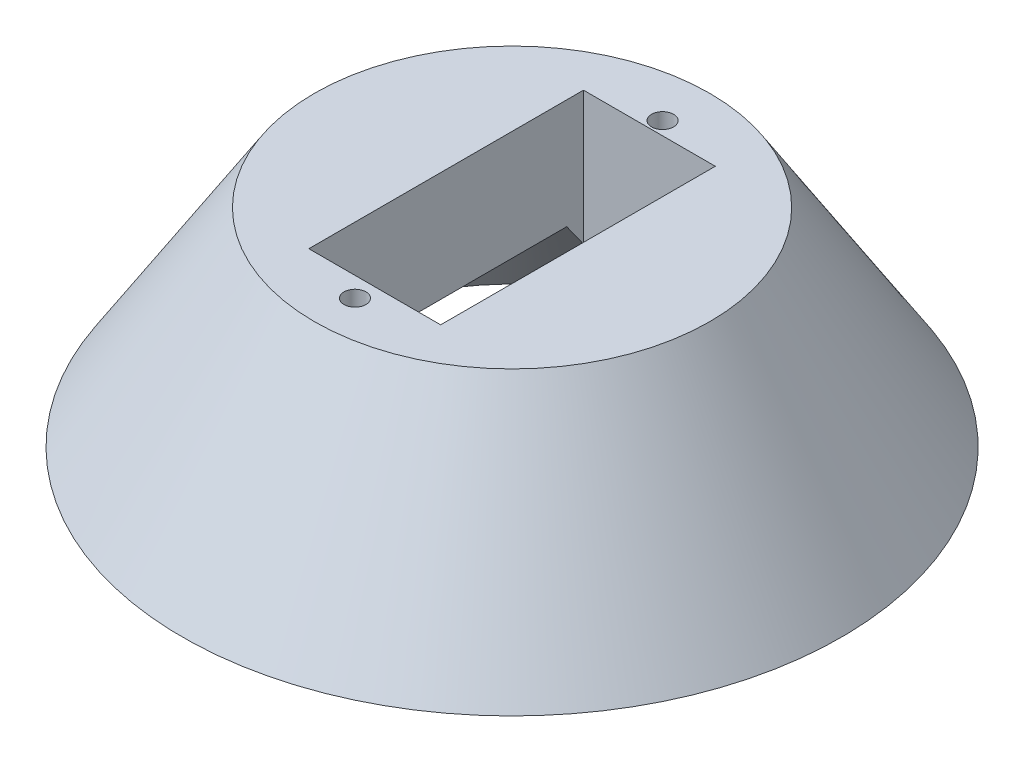
ISO-10303-21;
HEADER;
FILE_DESCRIPTION(('STEP AP214'),'2;1');
FILE_NAME('part.step','',(''),(''),'','','');
FILE_SCHEMA(('AUTOMOTIVE_DESIGN { 1 0 10303 214 1 1 1 1 }'));
ENDSEC;
DATA;
#1=APPLICATION_CONTEXT('core data for automotive mechanical design processes');
#2=APPLICATION_PROTOCOL_DEFINITION('international standard','automotive_design',2000,#1);
#3=PRODUCT_CONTEXT('',#1,'mechanical');
#4=PRODUCT('Part','Part','',(#3));
#5=PRODUCT_RELATED_PRODUCT_CATEGORY('part','',(#4));
#6=PRODUCT_DEFINITION_FORMATION('','',#4);
#7=PRODUCT_DEFINITION_CONTEXT('part definition',#1,'design');
#8=PRODUCT_DEFINITION('design','',#6,#7);
#9=PRODUCT_DEFINITION_SHAPE('','',#8);
#10=(LENGTH_UNIT() NAMED_UNIT(*) SI_UNIT(.MILLI.,.METRE.));
#11=(NAMED_UNIT(*) PLANE_ANGLE_UNIT() SI_UNIT($,.RADIAN.));
#12=(NAMED_UNIT(*) SI_UNIT($,.STERADIAN.) SOLID_ANGLE_UNIT());
#13=UNCERTAINTY_MEASURE_WITH_UNIT(LENGTH_MEASURE(1.E-05),#10,'distance_accuracy_value','');
#14=(GEOMETRIC_REPRESENTATION_CONTEXT(3) GLOBAL_UNCERTAINTY_ASSIGNED_CONTEXT((#13)) GLOBAL_UNIT_ASSIGNED_CONTEXT((#10,
#11,#12)) REPRESENTATION_CONTEXT('',''));
#15=CARTESIAN_POINT('',(0.,0.,0.));
#16=DIRECTION('',(0.,0.,1.));
#17=DIRECTION('',(1.,0.,0.));
#18=AXIS2_PLACEMENT_3D('',#15,#16,#17);
#19=CARTESIAN_POINT('',(0.,8.87265515455283,0.));
#20=DIRECTION('',(0.,-1.,0.));
#21=DIRECTION('',(0.,0.,-1.));
#22=AXIS2_PLACEMENT_3D('',#19,#20,#21);
#23=PLANE('',#22);
#24=DIRECTION('',(0.,0.,1.));
#25=VECTOR('',#24,1.);
#26=CARTESIAN_POINT('',(6.,8.87265515455283,0.));
#27=LINE('',#26,#25);
#28=CARTESIAN_POINT('',(6.,8.87265515455283,-10.9751087622099));
#29=VERTEX_POINT('',#28);
#30=CARTESIAN_POINT('',(6.,8.87265515455283,10.9751087622099));
#31=VERTEX_POINT('',#30);
#32=EDGE_CURVE('E143',#29,#31,#27,.T.);
#33=ORIENTED_EDGE('',*,*,#32,.F.);
#34=CARTESIAN_POINT('',(0.,8.87265515455283,0.));
#35=DIRECTION('',(0.,-1.,0.));
#36=DIRECTION('',(0.,0.,-1.));
#37=AXIS2_PLACEMENT_3D('',#34,#35,#36);
#38=CIRCLE('',#37,12.5081178577089);
#39=EDGE_CURVE('E150',#29,#31,#38,.T.);
#40=ORIENTED_EDGE('',*,*,#39,.T.);
#41=EDGE_LOOP('',(#33,#40));
#42=FACE_BOUND('',#41,.T.);
#43=ADVANCED_FACE('F35',(#42),#23,.T.);
#44=DIRECTION('',(-1.,0.,0.));
#45=VECTOR('',#44,1.);
#46=CARTESIAN_POINT('',(0.,8.87265515455283,12.5));
#47=LINE('',#46,#45);
#48=CARTESIAN_POINT('',(0.450568909643525,8.87265515455283,12.5));
#49=VERTEX_POINT('',#48);
#50=CARTESIAN_POINT('',(-0.450568909643525,8.87265515455284,12.5));
#51=VERTEX_POINT('',#50);
#52=EDGE_CURVE('E141',#49,#51,#47,.T.);
#53=ORIENTED_EDGE('',*,*,#52,.F.);
#54=EDGE_CURVE('E212',#49,#51,#38,.T.);
#55=ORIENTED_EDGE('',*,*,#54,.T.);
#56=EDGE_LOOP('',(#53,#55));
#57=FACE_BOUND('',#56,.T.);
#58=ADVANCED_FACE('F194',(#57),#23,.T.);
#59=DIRECTION('',(0.,0.,-1.));
#60=VECTOR('',#59,1.);
#61=CARTESIAN_POINT('',(-6.,8.87265515455283,0.));
#62=LINE('',#61,#60);
#63=CARTESIAN_POINT('',(-6.,8.87265515455283,10.9751087622099));
#64=VERTEX_POINT('',#63);
#65=CARTESIAN_POINT('',(-6.,8.87265515455283,-10.9751087622099));
#66=VERTEX_POINT('',#65);
#67=EDGE_CURVE('E139',#64,#66,#62,.T.);
#68=ORIENTED_EDGE('',*,*,#67,.F.);
#69=EDGE_CURVE('E149',#64,#66,#38,.T.);
#70=ORIENTED_EDGE('',*,*,#69,.T.);
#71=EDGE_LOOP('',(#68,#70));
#72=FACE_BOUND('',#71,.T.);
#73=ADVANCED_FACE('F186',(#72),#23,.T.);
#74=CARTESIAN_POINT('',(-30.,0.,0.));
#75=DIRECTION('',(0.,1.,0.));
#76=DIRECTION('',(0.,0.,1.));
#77=AXIS2_PLACEMENT_3D('',#74,#75,#76);
#78=PLANE('',#77);
#79=CARTESIAN_POINT('',(0.,0.,0.));
#80=DIRECTION('',(0.,1.,0.));
#81=DIRECTION('',(0.,0.,1.));
#82=AXIS2_PLACEMENT_3D('',#79,#80,#81);
#83=CIRCLE('',#82,18.1497120575028);
#84=CARTESIAN_POINT('',(0.,0.,18.1497120575028));
#85=VERTEX_POINT('',#84);
#86=EDGE_CURVE('E145',#85,#85,#83,.F.);
#87=ORIENTED_EDGE('',*,*,#86,.F.);
#88=EDGE_LOOP('',(#87));
#89=FACE_BOUND('',#88,.T.);
#90=CARTESIAN_POINT('',(0.,0.,0.));
#91=DIRECTION('',(0.,-1.,0.));
#92=DIRECTION('',(0.,0.,-1.));
#93=AXIS2_PLACEMENT_3D('',#90,#91,#92);
#94=CIRCLE('',#93,30.);
#95=CARTESIAN_POINT('',(0.,0.,-30.));
#96=VERTEX_POINT('',#95);
#97=EDGE_CURVE('E153',#96,#96,#94,.T.);
#98=ORIENTED_EDGE('',*,*,#97,.T.);
#99=EDGE_LOOP('',(#98));
#100=FACE_BOUND('',#99,.T.);
#101=ADVANCED_FACE('F37',(#89,#100),#78,.F.);
#102=CARTESIAN_POINT('',(0.,18.8726551545528,0.));
#103=DIRECTION('',(0.,-1.,0.));
#104=DIRECTION('',(0.,0.,-1.));
#105=AXIS2_PLACEMENT_3D('',#102,#103,#104);
#106=PLANE('',#105);
#107=CARTESIAN_POINT('',(0.,18.8726551545528,14.3));
#108=DIRECTION('',(0.,1.,0.));
#109=DIRECTION('',(0.,0.,1.));
#110=AXIS2_PLACEMENT_3D('',#107,#108,#109);
#111=CIRCLE('',#110,1.);
#112=CARTESIAN_POINT('',(0.,18.8726551545528,15.3));
#113=VERTEX_POINT('',#112);
#114=EDGE_CURVE('E231',#113,#113,#111,.T.);
#115=ORIENTED_EDGE('',*,*,#114,.F.);
#116=EDGE_LOOP('',(#115));
#117=FACE_BOUND('',#116,.T.);
#118=CARTESIAN_POINT('',(0.,18.8726551545528,-13.7));
#119=DIRECTION('',(0.,1.,0.));
#120=DIRECTION('',(0.,0.,1.));
#121=AXIS2_PLACEMENT_3D('',#118,#119,#120);
#122=CIRCLE('',#121,1.);
#123=CARTESIAN_POINT('',(0.,18.8726551545528,-12.7));
#124=VERTEX_POINT('',#123);
#125=EDGE_CURVE('E225',#124,#124,#122,.T.);
#126=ORIENTED_EDGE('',*,*,#125,.F.);
#127=EDGE_LOOP('',(#126));
#128=FACE_BOUND('',#127,.T.);
#129=DIRECTION('',(-1.,0.,0.));
#130=VECTOR('',#129,1.);
#131=CARTESIAN_POINT('',(-6.,18.8726551545528,-12.5));
#132=LINE('',#131,#130);
#133=CARTESIAN_POINT('',(6.,18.8726551545528,-12.5));
#134=VERTEX_POINT('',#133);
#135=CARTESIAN_POINT('',(-6.,18.8726551545528,-12.5));
#136=VERTEX_POINT('',#135);
#137=EDGE_CURVE('E122',#134,#136,#132,.T.);
#138=ORIENTED_EDGE('',*,*,#137,.F.);
#139=DIRECTION('',(0.,0.,-1.));
#140=VECTOR('',#139,1.);
#141=CARTESIAN_POINT('',(6.,18.8726551545528,-12.5));
#142=LINE('',#141,#140);
#143=CARTESIAN_POINT('',(6.,18.8726551545528,12.5));
#144=VERTEX_POINT('',#143);
#145=EDGE_CURVE('E58',#144,#134,#142,.T.);
#146=ORIENTED_EDGE('',*,*,#145,.F.);
#147=DIRECTION('',(1.,0.,0.));
#148=VECTOR('',#147,1.);
#149=CARTESIAN_POINT('',(-6.,18.8726551545528,12.5));
#150=LINE('',#149,#148);
#151=CARTESIAN_POINT('',(-6.,18.8726551545528,12.5));
#152=VERTEX_POINT('',#151);
#153=EDGE_CURVE('E129',#152,#144,#150,.T.);
#154=ORIENTED_EDGE('',*,*,#153,.F.);
#155=DIRECTION('',(0.,0.,1.));
#156=VECTOR('',#155,1.);
#157=CARTESIAN_POINT('',(-6.,18.8726551545528,-12.5));
#158=LINE('',#157,#156);
#159=EDGE_CURVE('E113',#136,#152,#158,.T.);
#160=ORIENTED_EDGE('',*,*,#159,.F.);
#161=EDGE_LOOP('',(#138,#146,#154,#160));
#162=FACE_BOUND('',#161,.T.);
#163=CARTESIAN_POINT('',(0.,18.8726551545528,0.));
#164=DIRECTION('',(0.,-1.,0.));
#165=DIRECTION('',(0.,0.,-1.));
#166=AXIS2_PLACEMENT_3D('',#163,#164,#165);
#167=CIRCLE('',#166,18.);
#168=CARTESIAN_POINT('',(0.,18.8726551545528,-18.));
#169=VERTEX_POINT('',#168);
#170=EDGE_CURVE('E156',#169,#169,#167,.T.);
#171=ORIENTED_EDGE('',*,*,#170,.F.);
#172=EDGE_LOOP('',(#171));
#173=FACE_BOUND('',#172,.T.);
#174=ADVANCED_FACE('F126',(#117,#128,#162,#173),#106,.F.);
#175=CARTESIAN_POINT('',(0.,18.8726551545528,0.));
#176=DIRECTION('',(0.,-1.,0.));
#177=DIRECTION('',(0.,0.,-1.));
#178=AXIS2_PLACEMENT_3D('',#175,#176,#177);
#179=CONICAL_SURFACE('',#178,18.,0.566356836274327);
#180=ORIENTED_EDGE('',*,*,#97,.F.);
#181=EDGE_LOOP('',(#180));
#182=FACE_BOUND('',#181,.T.);
#183=ORIENTED_EDGE('',*,*,#170,.T.);
#184=EDGE_LOOP('',(#183));
#185=FACE_BOUND('',#184,.T.);
#186=ADVANCED_FACE('F184',(#182,#185),#179,.T.);
#187=DIRECTION('',(1.,0.,0.));
#188=VECTOR('',#187,1.);
#189=CARTESIAN_POINT('',(0.,8.87265515455283,-12.5));
#190=LINE('',#189,#188);
#191=CARTESIAN_POINT('',(-0.450568909643315,8.87265515455283,-12.5));
#192=VERTEX_POINT('',#191);
#193=CARTESIAN_POINT('',(0.450568909643315,8.87265515455283,-12.5));
#194=VERTEX_POINT('',#193);
#195=EDGE_CURVE('E66',#192,#194,#190,.T.);
#196=ORIENTED_EDGE('',*,*,#195,.F.);
#197=EDGE_CURVE('E146',#192,#194,#38,.T.);
#198=ORIENTED_EDGE('',*,*,#197,.T.);
#199=EDGE_LOOP('',(#196,#198));
#200=FACE_BOUND('',#199,.T.);
#201=ADVANCED_FACE('F182',(#200),#23,.T.);
#202=CARTESIAN_POINT('',(0.,13.5070422419722,0.));
#203=DIRECTION('',(0.,-1.,0.));
#204=DIRECTION('',(0.,0.,-1.));
#205=AXIS2_PLACEMENT_3D('',#202,#203,#204);
#206=CONICAL_SURFACE('',#205,9.56138648400415,0.566356836274327);
#207=CARTESIAN_POINT('',(5.99999999999999,-15.9168781527108,-27.6262624378301));
#208=CARTESIAN_POINT('',(5.99999999999999,-15.3126835724449,-27.233132790407));
#209=CARTESIAN_POINT('',(5.99999999999999,-14.7086596688753,-26.8397408767398));
#210=CARTESIAN_POINT('',(5.99999999999999,-13.5010060074643,-26.0523516327815));
#211=CARTESIAN_POINT('',(5.99999999999999,-12.8973762499001,-25.6583543020652));
#212=CARTESIAN_POINT('',(5.99999999999999,-11.0869758609715,-24.4752142248008));
#213=CARTESIAN_POINT('',(5.99999999999999,-9.88087718198602,-23.6850424400323));
#214=CARTESIAN_POINT('',(5.99999999999999,-7.46555358113903,-22.0974124261076));
#215=CARTESIAN_POINT('',(5.99999999999999,-6.25633969599038,-21.2999373996958));
#216=CARTESIAN_POINT('',(5.99999999999999,-3.84143117645468,-19.700039547942));
#217=CARTESIAN_POINT('',(5.99999999999999,-2.6357360669921,-18.8976174408189));
#218=CARTESIAN_POINT('',(5.99999999999999,-0.757114520321862,-17.6391209416635));
#219=CARTESIAN_POINT('',(5.99999999999999,-0.0825167022128491,-17.1855422019821));
#220=CARTESIAN_POINT('',(5.99999999999999,1.26472542965406,-16.2754941540789));
#221=CARTESIAN_POINT('',(6.,1.93736974814721,-15.8190248528723));
#222=CARTESIAN_POINT('',(6.,3.28046335792535,-14.9021968694587));
#223=CARTESIAN_POINT('',(6.,3.95091148473578,-14.4418364794238));
#224=CARTESIAN_POINT('',(6.,5.28847181410914,-13.5163337713375));
#225=CARTESIAN_POINT('',(6.,5.955584118522,-13.0511916006258));
#226=CARTESIAN_POINT('',(6.,7.28351983328237,-12.1157721863574));
#227=CARTESIAN_POINT('',(6.,7.9443553622316,-11.6455122036121));
#228=CARTESIAN_POINT('',(6.,8.93087755007904,-10.9334703818235));
#229=CARTESIAN_POINT('',(6.,9.25895239805388,-10.6949976618883));
#230=CARTESIAN_POINT('',(6.,9.91315804063228,-10.2154007818022));
#231=CARTESIAN_POINT('',(6.,10.2392888458522,-9.97427663615103));
#232=CARTESIAN_POINT('',(6.,10.8889121542176,-9.48902104127777));
#233=CARTESIAN_POINT('',(6.,11.2124065168235,-9.24489208445668));
#234=CARTESIAN_POINT('',(6.,11.8564132462709,-8.75273388074434));
#235=CARTESIAN_POINT('',(6.,12.1769256568281,-8.50470469117457));
#236=CARTESIAN_POINT('',(6.,12.8140761956443,-8.00385757957522));
#237=CARTESIAN_POINT('',(6.,13.130715183779,-7.7510407533326));
#238=CARTESIAN_POINT('',(6.,13.7590184537992,-7.23931181870506));
#239=CARTESIAN_POINT('',(6.,14.0706830871404,-6.98040014417015));
#240=CARTESIAN_POINT('',(6.,14.525985432256,-6.59222443113));
#241=CARTESIAN_POINT('',(6.,14.6722193621911,-6.46600361465007));
#242=CARTESIAN_POINT('',(6.,14.9629028683053,-6.21150780494194));
#243=CARTESIAN_POINT('',(6.,15.1073523685431,-6.08323272481863));
#244=CARTESIAN_POINT('',(6.,15.3942104903811,-5.82428259589198));
#245=CARTESIAN_POINT('',(6.,15.5366181204284,-5.69360644698792));
#246=CARTESIAN_POINT('',(6.,15.8189179734786,-5.42956405902529));
#247=CARTESIAN_POINT('',(6.,15.9588102397277,-5.2961978663));
#248=CARTESIAN_POINT('',(6.,16.234583156384,-5.0273147544182));
#249=CARTESIAN_POINT('',(6.,16.370485277699,-4.89181990926772));
#250=CARTESIAN_POINT('',(6.,16.6386497474489,-4.61727788563721));
#251=CARTESIAN_POINT('',(6.,16.7709122936149,-4.47823090093262));
#252=CARTESIAN_POINT('',(6.,17.0308707852605,-4.19607936025323));
#253=CARTESIAN_POINT('',(6.,17.1585695549895,-4.05297741553014));
#254=CARTESIAN_POINT('',(6.,17.4083397347131,-3.76196318558314));
#255=CARTESIAN_POINT('',(6.,17.5304122849731,-3.61405188552675));
#256=CARTESIAN_POINT('',(6.,17.7413702588891,-3.34573127258394));
#257=CARTESIAN_POINT('',(6.,17.831652666456,-3.22642286932841));
#258=CARTESIAN_POINT('',(6.,18.0069218328438,-2.98395960997689));
#259=CARTESIAN_POINT('',(6.,18.0919086795007,-2.86080481773077));
#260=CARTESIAN_POINT('',(6.,18.255517002875,-2.6100354621002));
#261=CARTESIAN_POINT('',(6.,18.3341283234257,-2.48241422928049));
#262=CARTESIAN_POINT('',(6.,18.4833293632309,-2.22251792254373));
#263=CARTESIAN_POINT('',(6.,18.5539185552323,-2.09024254348107));
#264=CARTESIAN_POINT('',(6.,18.6864450288053,-1.81830790057144));
#265=CARTESIAN_POINT('',(6.,18.7481960779033,-1.67855686587413));
#266=CARTESIAN_POINT('',(6.,18.8591602645472,-1.3941062007895));
#267=CARTESIAN_POINT('',(6.,18.908374145935,-1.24940686456762));
#268=CARTESIAN_POINT('',(6.,18.9916899752537,-0.956272249012215));
#269=CARTESIAN_POINT('',(6.,19.0258507221621,-0.807853942814166));
#270=CARTESIAN_POINT('',(6.,19.0772277103534,-0.508105959752052));
#271=CARTESIAN_POINT('',(6.,19.0944505471445,-0.3567774395276));
#272=CARTESIAN_POINT('',(6.,19.1095665746562,-0.0754010957673041));
#273=CARTESIAN_POINT('',(6.,19.1099209945149,0.0545179889062065));
#274=CARTESIAN_POINT('',(6.,19.0974169083773,0.313706434806741));
#275=CARTESIAN_POINT('',(6.,19.0845593967104,0.442975844192578));
#276=CARTESIAN_POINT('',(6.,19.0462813195916,0.699768640661928));
#277=CARTESIAN_POINT('',(6.,19.0208461225385,0.827289816042772));
#278=CARTESIAN_POINT('',(6.,18.9585999941954,1.07951149670796));
#279=CARTESIAN_POINT('',(6.,18.9217866484432,1.2042113972798));
#280=CARTESIAN_POINT('',(6.,18.8253089215805,1.48823933558494));
#281=CARTESIAN_POINT('',(6.,18.7620985409945,1.64635901108841));
#282=CARTESIAN_POINT('',(6.,18.6219239486926,1.95634675048249));
#283=CARTESIAN_POINT('',(6.,18.5449533709329,2.10821188057559));
#284=CARTESIAN_POINT('',(6.,18.3798046770518,2.40645981522455));
#285=CARTESIAN_POINT('',(6.,18.2915831830074,2.55281840009989));
#286=CARTESIAN_POINT('',(6.,18.1527946691678,2.76810154864737));
#287=CARTESIAN_POINT('',(6.,18.1054612969433,2.83914596446117));
#288=CARTESIAN_POINT('',(6.,18.0088657065688,2.97991051863297));
#289=CARTESIAN_POINT('',(6.,17.959603528388,3.04963068438803));
#290=CARTESIAN_POINT('',(6.,17.8064472297994,3.26078476143411));
#291=CARTESIAN_POINT('',(6.,17.6997859508057,3.40021598872372));
#292=CARTESIAN_POINT('',(6.,17.4807052747677,3.67449892829697));
#293=CARTESIAN_POINT('',(6.,17.3682843841949,3.80934943752149));
#294=CARTESIAN_POINT('',(6.,17.13872377164,4.07516730794222));
#295=CARTESIAN_POINT('',(6.,17.0215799759204,4.20613114004307));
#296=CARTESIAN_POINT('',(6.,16.7835132673664,4.46458588720908));
#297=CARTESIAN_POINT('',(6.,16.6625899889084,4.59207646402782));
#298=CARTESIAN_POINT('',(6.,16.2943235026672,4.97092179454138));
#299=CARTESIAN_POINT('',(6.,16.0422979387272,5.2177256477209));
#300=CARTESIAN_POINT('',(6.,15.5297137164716,5.70195953473538));
#301=CARTESIAN_POINT('',(6.,15.2691590871864,5.9393938809639));
#302=CARTESIAN_POINT('',(6.,14.737619694837,6.41070089984397));
#303=CARTESIAN_POINT('',(6.,14.4665359062273,6.64446152336047));
#304=CARTESIAN_POINT('',(6.,13.9194320614499,7.10616730352582));
#305=CARTESIAN_POINT('',(6.,13.6434114935506,7.33411185128532));
#306=CARTESIAN_POINT('',(6.,13.0882349441316,7.78478511097461));
#307=CARTESIAN_POINT('',(6.,12.8090879141433,8.00752487635944));
#308=CARTESIAN_POINT('',(6.,12.2478256349905,8.44919771963582));
#309=CARTESIAN_POINT('',(6.,11.9657105259886,8.6681309759997));
#310=CARTESIAN_POINT('',(6.,11.3926075190947,9.10783221126414));
#311=CARTESIAN_POINT('',(6.,11.101564169824,9.328527817415));
#312=CARTESIAN_POINT('',(6.,10.5174272434571,9.76719088565178));
#313=CARTESIAN_POINT('',(6.,10.2243336463214,9.9851583210138));
#314=CARTESIAN_POINT('',(6.,9.34250576089848,10.6356583278152));
#315=CARTESIAN_POINT('',(6.,8.75124838794572,11.0647703070878));
#316=CARTESIAN_POINT('',(6.,7.5638980356108,11.9164463249209));
#317=CARTESIAN_POINT('',(6.,6.96780423117829,12.3390092088973));
#318=CARTESIAN_POINT('',(6.,5.7721079263586,13.1791475528772));
#319=CARTESIAN_POINT('',(6.,5.17250539367885,13.5967229668705));
#320=CARTESIAN_POINT('',(6.,3.96964889123346,14.4287108442681));
#321=CARTESIAN_POINT('',(6.,3.3663905265421,14.8431169452386));
#322=CARTESIAN_POINT('',(6.,2.15779256709644,15.6688873676963));
#323=CARTESIAN_POINT('',(6.,1.55245296167229,16.0802516735551));
#324=CARTESIAN_POINT('',(6.,0.340188151452066,16.900494885644));
#325=CARTESIAN_POINT('',(6.,-0.266736875804679,17.3093740544292));
#326=CARTESIAN_POINT('',(6.,-1.48192355036626,18.1251412091322));
#327=CARTESIAN_POINT('',(6.,-2.0901851986106,18.5320291936497));
#328=CARTESIAN_POINT('',(6.,-3.79682009246443,19.6703449594558));
#329=CARTESIAN_POINT('',(6.,-4.8964207459566,20.3999323312618));
#330=CARTESIAN_POINT('',(6.,-7.09820801907666,21.8552672842211));
#331=CARTESIAN_POINT('',(6.,-8.20039472069587,22.5810147411881));
#332=CARTESIAN_POINT('',(6.,-10.4041594091179,24.0279572575046));
#333=CARTESIAN_POINT('',(6.,-11.5057330615638,24.7491589215155));
#334=CARTESIAN_POINT('',(6.,-13.7103195982903,26.1892684798272));
#335=CARTESIAN_POINT('',(6.,-14.8133324266,26.9081764597933));
#336=CARTESIAN_POINT('',(6.,-15.9168781527108,27.6262624378301));
#337=B_SPLINE_CURVE_WITH_KNOTS('',3,(#207,#208,#209,#210,#211,#212,#213,#214,#215,#216,#217,
#218,#219,#220,#221,#222,#223,#224,#225,#226,#227,#228,#229,#230,#231,#232,#233,#234,#235,#236,
#237,#238,#239,#240,#241,#242,#243,#244,#245,#246,#247,#248,#249,#250,#251,#252,#253,#254,#255,
#256,#257,#258,#259,#260,#261,#262,#263,#264,#265,#266,#267,#268,#269,#270,#271,#272,#273,#274,
#275,#276,#277,#278,#279,#280,#281,#282,#283,#284,#285,#286,#287,#288,#289,#290,#291,#292,#293,
#294,#295,#296,#297,#298,#299,#300,#301,#302,#303,#304,#305,#306,#307,#308,#309,#310,#311,#312,
#313,#314,#315,#316,#317,#318,#319,#320,#321,#322,#323,#324,#325,#326,#327,#328,#329,#330,#331,
#332,#333,#334,#335,#336),.UNSPECIFIED.,.F.,.F.,(4,2,2,2,2,2,2,2,2,2,2,2,2,2,2,2,2,2,2,2,2,2,2,
2,2,2,2,2,2,2,2,2,2,2,2,2,2,2,2,2,2,2,2,2,2,2,2,2,2,2,2,2,2,2,2,2,2,2,2,2,2,2,2,2,4),(0.,
2.16250257001752,4.32500665965879,8.65066995335786,12.9961749482287,17.3410632583344,
19.7797750976502,22.2184810206227,24.6583195101852,27.0980830456371,29.5312575514592,
30.748013941816,31.9647636814151,33.1805643546738,34.3963471760549,35.6118550159116,
36.8272765922738,37.4067823811766,37.9863127481969,38.5661156092595,39.1459084923154,
39.7215732622518,40.2972066954423,40.8724775075751,41.4476312122697,41.8963669027288,
42.3450951481523,42.7945247201779,43.2439838138271,43.7018381354544,44.1596652858228,
44.6156879151327,45.0715329019102,45.4606260586614,45.8496899344252,46.2392074760862,
46.6288077308424,47.1388126894372,47.6490542111969,48.161326068732,48.4174061767696,
48.6734809810487,49.1999196884482,49.7264956048332,50.2535358660281,50.7806272714064,
51.8385014460124,52.8958829070867,53.9696343714838,55.043497790288,56.114823352054,
57.1860985473592,58.2818505688612,59.3776133154604,61.5692293496179,63.761227461433,
65.9532457791252,68.1488841687064,70.3445338314604,72.5399473442138,74.7353624006096,
78.694235101451,82.6532350628621,86.6032151221549,90.5530458878347),.UNSPECIFIED.);
#338=CARTESIAN_POINT('',(6.,6.73798994317377,12.5));
#339=VERTEX_POINT('',#338);
#340=EDGE_CURVE('E11',#31,#339,#337,.T.);
#341=ORIENTED_EDGE('',*,*,#340,.F.);
#342=ORIENTED_EDGE('',*,*,#39,.F.);
#343=CARTESIAN_POINT('',(6.,6.73798994317376,-12.5));
#344=VERTEX_POINT('',#343);
#345=EDGE_CURVE('E51',#344,#29,#337,.T.);
#346=ORIENTED_EDGE('',*,*,#345,.F.);
#347=CARTESIAN_POINT('',(-14.9545644898441,-2.1090653110314,-12.5));
#348=CARTESIAN_POINT('',(-14.7905860451103,-1.91119687699622,-12.5));
#349=CARTESIAN_POINT('',(-14.6259537384979,-1.71387070684671,-12.5));
#350=CARTESIAN_POINT('',(-14.2952641459143,-1.32041120754002,-12.5));
#351=CARTESIAN_POINT('',(-14.1292068385113,-1.12427789639942,-12.5));
#352=CARTESIAN_POINT('',(-13.6286430897577,-0.537738022586104,-12.5));
#353=CARTESIAN_POINT('',(-13.291829114381,-0.149293490649965,-12.5));
#354=CARTESIAN_POINT('',(-12.6074278901442,0.625195437029527,-12.5));
#355=CARTESIAN_POINT('',(-12.2597651823796,1.0111732815467,-12.5));
#356=CARTESIAN_POINT('',(-11.555654024671,1.77497877032646,-12.5));
#357=CARTESIAN_POINT('',(-11.199206550925,2.15280731150002,-12.5));
#358=CARTESIAN_POINT('',(-10.4541185132385,2.92043890116477,-12.5));
#359=CARTESIAN_POINT('',(-10.0648260445997,3.30961145445404,-12.5));
#360=CARTESIAN_POINT('',(-9.27146681100157,4.07300619295772,-12.5));
#361=CARTESIAN_POINT('',(-8.86739533397758,4.44722352892616,-12.5));
#362=CARTESIAN_POINT('',(-8.24862880785136,4.99239159674942,-12.5));
#363=CARTESIAN_POINT('',(-8.04072169077487,5.17105615705812,-12.5));
#364=CARTESIAN_POINT('',(-7.61991566046548,5.52239445514051,-12.5));
#365=CARTESIAN_POINT('',(-7.40701714921472,5.69506867258829,-12.5));
#366=CARTESIAN_POINT('',(-6.97580914164508,6.03325189091886,-12.5));
#367=CARTESIAN_POINT('',(-6.75750317216291,6.19876537821876,-12.5));
#368=CARTESIAN_POINT('',(-6.31479281091214,6.5213910485957,-12.5));
#369=CARTESIAN_POINT('',(-6.09038953971989,6.67850475986164,-12.5));
#370=CARTESIAN_POINT('',(-5.7437863287142,6.9099710773435,-12.5));
#371=CARTESIAN_POINT('',(-5.62402006915403,6.98797692722963,-12.5));
#372=CARTESIAN_POINT('',(-5.38258287182946,7.1409791380224,-12.5));
#373=CARTESIAN_POINT('',(-5.26091194228407,7.21597551191051,-12.5));
#374=CARTESIAN_POINT('',(-4.89284953254574,7.43605584583607,-12.5));
#375=CARTESIAN_POINT('',(-4.64346037416084,7.57619602991506,-12.5));
#376=CARTESIAN_POINT('',(-4.13783940656856,7.83968489317608,-12.5));
#377=CARTESIAN_POINT('',(-3.88165820687885,7.96313015884229,-12.5));
#378=CARTESIAN_POINT('',(-3.3609367986268,8.19100533557045,-12.5));
#379=CARTESIAN_POINT('',(-3.09639833304536,8.29543918130503,-12.5));
#380=CARTESIAN_POINT('',(-2.60162683578794,8.4671403124049,-12.5));
#381=CARTESIAN_POINT('',(-2.37252989365237,8.53766868642334,-12.5));
#382=CARTESIAN_POINT('',(-1.9094988730876,8.66060382323476,-12.5));
#383=CARTESIAN_POINT('',(-1.67556532027167,8.71301254430421,-12.5));
#384=CARTESIAN_POINT('',(-1.20433909872181,8.79781353436443,-12.5));
#385=CARTESIAN_POINT('',(-0.967050595065291,8.83022871577867,-12.5));
#386=CARTESIAN_POINT('',(-0.490512829658868,8.87384789156811,-12.5));
#387=CARTESIAN_POINT('',(-0.251263593892178,8.88505216657084,-12.5));
#388=CARTESIAN_POINT('',(0.227869535798434,8.88577519403504,-12.5));
#389=CARTESIAN_POINT('',(0.467753515035951,8.87523943049983,-12.5));
#390=CARTESIAN_POINT('',(0.945606021768085,8.83282236529117,-12.5));
#391=CARTESIAN_POINT('',(1.1835745311662,8.80094086219169,-12.5));
#392=CARTESIAN_POINT('',(1.65615678123559,8.71706584172614,-12.5));
#393=CARTESIAN_POINT('',(1.89076684634792,8.66505181136989,-12.5));
#394=CARTESIAN_POINT('',(2.35515411530816,8.54276843903965,-12.5));
#395=CARTESIAN_POINT('',(2.58493061997499,8.47249647539386,-12.5));
#396=CARTESIAN_POINT('',(3.14975351557568,8.27753792726493,-12.5));
#397=CARTESIAN_POINT('',(3.48141853499191,8.14303580908989,-12.5));
#398=CARTESIAN_POINT('',(4.13152676363264,7.84521605580658,-12.5));
#399=CARTESIAN_POINT('',(4.44996143434407,7.68188015833499,-12.5));
#400=CARTESIAN_POINT('',(5.07700158322568,7.33080809872593,-12.5));
#401=CARTESIAN_POINT('',(5.38548342942102,7.1428528474124,-12.5));
#402=CARTESIAN_POINT('',(5.83915233533935,6.84733619328959,-12.5));
#403=CARTESIAN_POINT('',(5.98884806021026,6.7465802111261,-12.5));
#404=CARTESIAN_POINT('',(6.28543031313629,6.54100895519202,-12.5));
#405=CARTESIAN_POINT('',(6.43231681199564,6.43619363926772,-12.5));
#406=CARTESIAN_POINT('',(6.99030649047021,6.02754775494813,-12.5));
#407=CARTESIAN_POINT('',(7.39219698037836,5.71108974089143,-12.5));
#408=CARTESIAN_POINT('',(8.17860809477851,5.05720767060473,-12.5));
#409=CARTESIAN_POINT('',(8.5631200364915,4.71977332973918,-12.5));
#410=CARTESIAN_POINT('',(9.31885028392679,4.02832603238547,-12.5));
#411=CARTESIAN_POINT('',(9.69002834482963,3.67426929358968,-12.5));
#412=CARTESIAN_POINT('',(10.4204403587262,2.95424396758571,-12.5));
#413=CARTESIAN_POINT('',(10.7796765517187,2.58827764009969,-12.5));
#414=CARTESIAN_POINT('',(11.4675670361606,1.86869720628126,-12.5));
#415=CARTESIAN_POINT('',(11.7967800922105,1.51561526307964,-12.5));
#416=CARTESIAN_POINT('',(12.4478777791423,0.80272783164519,-12.5));
#417=CARTESIAN_POINT('',(12.7697618975205,0.442921876394061,-12.5));
#418=CARTESIAN_POINT('',(13.405157492097,-0.279742908801265,-12.5));
#419=CARTESIAN_POINT('',(13.7187105380217,-0.642565282959538,-12.5));
#420=CARTESIAN_POINT('',(14.3404415879604,-1.37267112918069,-12.5));
#421=CARTESIAN_POINT('',(14.6486206041368,-1.73995373859116,-12.5));
#422=CARTESIAN_POINT('',(14.9545644898441,-2.10906531103139,-12.5));
#423=B_SPLINE_CURVE_WITH_KNOTS('',3,(#347,#348,#349,#350,#351,#352,#353,#354,#355,#356,#357,
#358,#359,#360,#361,#362,#363,#364,#365,#366,#367,#368,#369,#370,#371,#372,#373,#374,#375,#376,
#377,#378,#379,#380,#381,#382,#383,#384,#385,#386,#387,#388,#389,#390,#391,#392,#393,#394,#395,
#396,#397,#398,#399,#400,#401,#402,#403,#404,#405,#406,#407,#408,#409,#410,#411,#412,#413,#414,
#415,#416,#417,#418,#419,#420,#421,#422),.UNSPECIFIED.,.F.,.F.,(4,2,2,2,2,2,2,2,2,2,2,2,2,2,2,2,
2,2,2,2,2,2,2,2,2,2,2,2,2,2,2,2,2,2,2,2,2,4),(0.,0.770949764093326,1.54191114359555,
3.08423076302806,4.64252796037255,6.20065276748894,7.85173922016449,9.50335676617052,
10.3256541338494,11.1478855037238,11.9695940308804,12.791152550568,13.2199014193177,
13.6486484384462,14.5063301358559,15.3588156223224,16.2111244742056,16.9295957738627,
17.6479894006427,18.3655582174381,19.0831175404871,19.802478424144,20.5218460960427,
21.2419486678575,21.9621546969986,23.034021984796,24.1065706097373,25.1894106411822,
25.7306944570568,26.2719838953418,27.805455953858,29.3396858919254,30.8782124748526,
32.4164488209359,33.8645803116179,35.312812759308,36.7513696917637,38.1896526897396),.UNSPECIFIED.);
#424=EDGE_CURVE('E159',#194,#344,#423,.T.);
#425=ORIENTED_EDGE('',*,*,#424,.F.);
#426=ORIENTED_EDGE('',*,*,#197,.F.);
#427=CARTESIAN_POINT('',(-6.,6.73798994317375,-12.5));
#428=VERTEX_POINT('',#427);
#429=EDGE_CURVE('E164',#428,#192,#423,.T.);
#430=ORIENTED_EDGE('',*,*,#429,.F.);
#431=CARTESIAN_POINT('',(-6.,-15.9168781527108,27.6262624378301));
#432=CARTESIAN_POINT('',(-6.,-15.3126835724449,27.233132790407));
#433=CARTESIAN_POINT('',(-6.,-14.7086596688753,26.8397408767398));
#434=CARTESIAN_POINT('',(-6.,-13.5010060074643,26.0523516327815));
#435=CARTESIAN_POINT('',(-6.,-12.8973762499001,25.6583543020652));
#436=CARTESIAN_POINT('',(-6.,-11.0869758609715,24.4752142248008));
#437=CARTESIAN_POINT('',(-6.,-9.88087718198603,23.6850424400324));
#438=CARTESIAN_POINT('',(-6.,-7.46555358113904,22.0974124261076));
#439=CARTESIAN_POINT('',(-6.,-6.25633969599039,21.2999373996958));
#440=CARTESIAN_POINT('',(-6.,-3.84143117645469,19.700039547942));
#441=CARTESIAN_POINT('',(-6.,-2.63573606699211,18.8976174408189));
#442=CARTESIAN_POINT('',(-6.,-0.757114520321878,17.6391209416635));
#443=CARTESIAN_POINT('',(-6.,-0.0825167022128645,17.1855422019821));
#444=CARTESIAN_POINT('',(-6.,1.26472542965405,16.2754941540789));
#445=CARTESIAN_POINT('',(-6.,1.9373697481472,15.8190248528723));
#446=CARTESIAN_POINT('',(-6.,3.28046335792534,14.9021968694587));
#447=CARTESIAN_POINT('',(-6.,3.95091148473578,14.4418364794238));
#448=CARTESIAN_POINT('',(-6.,5.28847181410913,13.5163337713375));
#449=CARTESIAN_POINT('',(-6.,5.955584118522,13.0511916006258));
#450=CARTESIAN_POINT('',(-6.,7.28351983328236,12.1157721863574));
#451=CARTESIAN_POINT('',(-6.,7.9443553622316,11.6455122036121));
#452=CARTESIAN_POINT('',(-6.,8.93087755007903,10.9334703818235));
#453=CARTESIAN_POINT('',(-6.,9.25895239805388,10.6949976618883));
#454=CARTESIAN_POINT('',(-6.,9.91315804063228,10.2154007818022));
#455=CARTESIAN_POINT('',(-6.,10.2392888458522,9.97427663615103));
#456=CARTESIAN_POINT('',(-6.,10.8889121542176,9.48902104127777));
#457=CARTESIAN_POINT('',(-6.,11.2124065168235,9.24489208445667));
#458=CARTESIAN_POINT('',(-6.,11.8564132462709,8.75273388074434));
#459=CARTESIAN_POINT('',(-6.,12.1769256568281,8.50470469117457));
#460=CARTESIAN_POINT('',(-6.,12.8140761956443,8.00385757957523));
#461=CARTESIAN_POINT('',(-6.,13.130715183779,7.7510407533326));
#462=CARTESIAN_POINT('',(-6.,13.7590184537992,7.23931181870506));
#463=CARTESIAN_POINT('',(-6.,14.0706830871404,6.98040014417015));
#464=CARTESIAN_POINT('',(-6.,14.525985432256,6.59222443113));
#465=CARTESIAN_POINT('',(-6.,14.6722193621911,6.46600361465006));
#466=CARTESIAN_POINT('',(-6.,14.9629028683053,6.21150780494193));
#467=CARTESIAN_POINT('',(-6.,15.1073523685431,6.08323272481862));
#468=CARTESIAN_POINT('',(-6.,15.3942104903811,5.82428259589198));
#469=CARTESIAN_POINT('',(-6.,15.5366181204284,5.69360644698792));
#470=CARTESIAN_POINT('',(-6.,15.8189179734786,5.42956405902528));
#471=CARTESIAN_POINT('',(-6.,15.9588102397277,5.29619786629999));
#472=CARTESIAN_POINT('',(-6.,16.234583156384,5.02731475441819));
#473=CARTESIAN_POINT('',(-6.,16.370485277699,4.89181990926772));
#474=CARTESIAN_POINT('',(-6.,16.6386497474489,4.61727788563721));
#475=CARTESIAN_POINT('',(-6.,16.7709122936149,4.47823090093262));
#476=CARTESIAN_POINT('',(-6.,17.0308707852605,4.19607936025322));
#477=CARTESIAN_POINT('',(-6.,17.1585695549895,4.05297741553014));
#478=CARTESIAN_POINT('',(-6.,17.4083397347131,3.76196318558313));
#479=CARTESIAN_POINT('',(-6.,17.5304122849731,3.61405188552675));
#480=CARTESIAN_POINT('',(-6.,17.7413702588891,3.34573127258394));
#481=CARTESIAN_POINT('',(-6.,17.831652666456,3.22642286932841));
#482=CARTESIAN_POINT('',(-6.,18.0069218328438,2.98395960997688));
#483=CARTESIAN_POINT('',(-6.,18.0919086795007,2.86080481773076));
#484=CARTESIAN_POINT('',(-6.,18.255517002875,2.61003546210019));
#485=CARTESIAN_POINT('',(-6.,18.3341283234257,2.48241422928048));
#486=CARTESIAN_POINT('',(-6.,18.4833293632309,2.22251792254373));
#487=CARTESIAN_POINT('',(-6.,18.5539185552323,2.09024254348106));
#488=CARTESIAN_POINT('',(-6.,18.6864450288053,1.81830790057143));
#489=CARTESIAN_POINT('',(-6.,18.7481960779033,1.67855686587412));
#490=CARTESIAN_POINT('',(-6.,18.8591602645472,1.39410620078949));
#491=CARTESIAN_POINT('',(-6.,18.908374145935,1.24940686456762));
#492=CARTESIAN_POINT('',(-6.,18.9916899752537,0.956272249012213));
#493=CARTESIAN_POINT('',(-6.,19.0258507221621,0.807853942814163));
#494=CARTESIAN_POINT('',(-6.,19.0772277103534,0.508105959752046));
#495=CARTESIAN_POINT('',(-6.,19.0944505471445,0.356777439527594));
#496=CARTESIAN_POINT('',(-6.,19.1095665746562,0.0754010957672981));
#497=CARTESIAN_POINT('',(-6.,19.1099209945149,-0.0545179889062123));
#498=CARTESIAN_POINT('',(-6.,19.0974169083773,-0.313706434806745));
#499=CARTESIAN_POINT('',(-6.,19.0845593967104,-0.442975844192579));
#500=CARTESIAN_POINT('',(-6.,19.0462813195916,-0.699768640661929));
#501=CARTESIAN_POINT('',(-6.,19.0208461225384,-0.827289816042775));
#502=CARTESIAN_POINT('',(-6.,18.9585999941954,-1.07951149670796));
#503=CARTESIAN_POINT('',(-6.,18.9217866484432,-1.2042113972798));
#504=CARTESIAN_POINT('',(-6.,18.8253089215805,-1.48823933558494));
#505=CARTESIAN_POINT('',(-6.,18.7620985409945,-1.64635901108841));
#506=CARTESIAN_POINT('',(-6.,18.6219239486925,-1.9563467504825));
#507=CARTESIAN_POINT('',(-6.,18.5449533709329,-2.1082118805756));
#508=CARTESIAN_POINT('',(-6.,18.3798046770518,-2.40645981522455));
#509=CARTESIAN_POINT('',(-6.,18.2915831830074,-2.5528184000999));
#510=CARTESIAN_POINT('',(-6.,18.1527946691678,-2.76810154864738));
#511=CARTESIAN_POINT('',(-6.,18.1054612969433,-2.83914596446117));
#512=CARTESIAN_POINT('',(-6.,18.0088657065688,-2.97991051863297));
#513=CARTESIAN_POINT('',(-6.,17.959603528388,-3.04963068438804));
#514=CARTESIAN_POINT('',(-6.,17.8064472297993,-3.26078476143412));
#515=CARTESIAN_POINT('',(-6.,17.6997859508057,-3.40021598872372));
#516=CARTESIAN_POINT('',(-6.,17.4807052747677,-3.67449892829699));
#517=CARTESIAN_POINT('',(-6.,17.3682843841949,-3.8093494375215));
#518=CARTESIAN_POINT('',(-6.,17.13872377164,-4.07516730794224));
#519=CARTESIAN_POINT('',(-6.,17.0215799759203,-4.20613114004308));
#520=CARTESIAN_POINT('',(-6.,16.7835132673664,-4.46458588720909));
#521=CARTESIAN_POINT('',(-6.,16.6625899889083,-4.59207646402784));
#522=CARTESIAN_POINT('',(-6.,16.2943235026672,-4.97092179454139));
#523=CARTESIAN_POINT('',(-6.,16.0422979387272,-5.21772564772091));
#524=CARTESIAN_POINT('',(-6.,15.5297137164716,-5.7019595347354));
#525=CARTESIAN_POINT('',(-6.,15.2691590871864,-5.93939388096392));
#526=CARTESIAN_POINT('',(-6.,14.737619694837,-6.41070089984399));
#527=CARTESIAN_POINT('',(-6.,14.4665359062273,-6.64446152336049));
#528=CARTESIAN_POINT('',(-6.,13.9194320614499,-7.10616730352584));
#529=CARTESIAN_POINT('',(-6.,13.6434114935506,-7.33411185128535));
#530=CARTESIAN_POINT('',(-6.,13.0882349441316,-7.78478511097464));
#531=CARTESIAN_POINT('',(-6.,12.8090879141432,-8.00752487635946));
#532=CARTESIAN_POINT('',(-6.,12.2478256349905,-8.44919771963585));
#533=CARTESIAN_POINT('',(-6.,11.9657105259886,-8.66813097599973));
#534=CARTESIAN_POINT('',(-6.,11.3926075190947,-9.10783221126417));
#535=CARTESIAN_POINT('',(-6.,11.1015641698239,-9.32852781741502));
#536=CARTESIAN_POINT('',(-6.,10.517427243457,-9.7671908856518));
#537=CARTESIAN_POINT('',(-6.,10.2243336463214,-9.98515832101383));
#538=CARTESIAN_POINT('',(-6.,9.34250576089844,-10.6356583278152));
#539=CARTESIAN_POINT('',(-6.,8.75124838794568,-11.0647703070878));
#540=CARTESIAN_POINT('',(-6.,7.56389803561076,-11.9164463249209));
#541=CARTESIAN_POINT('',(-6.,6.96780423117825,-12.3390092088973));
#542=CARTESIAN_POINT('',(-6.,5.77210792635857,-13.1791475528772));
#543=CARTESIAN_POINT('',(-6.,5.17250539367882,-13.5967229668705));
#544=CARTESIAN_POINT('',(-6.,3.96964889123343,-14.4287108442681));
#545=CARTESIAN_POINT('',(-6.,3.36639052654207,-14.8431169452386));
#546=CARTESIAN_POINT('',(-6.,2.15779256709642,-15.6688873676963));
#547=CARTESIAN_POINT('',(-6.00000000000001,1.55245296167227,-16.0802516735551));
#548=CARTESIAN_POINT('',(-6.00000000000001,0.340188151452047,-16.900494885644));
#549=CARTESIAN_POINT('',(-6.00000000000001,-0.266736875804695,-17.3093740544292));
#550=CARTESIAN_POINT('',(-6.00000000000001,-1.48192355036627,-18.1251412091322));
#551=CARTESIAN_POINT('',(-6.00000000000001,-2.09018519861061,-18.5320291936497));
#552=CARTESIAN_POINT('',(-6.00000000000001,-3.79682009246443,-19.6703449594558));
#553=CARTESIAN_POINT('',(-6.00000000000001,-4.89642074595659,-20.3999323312618));
#554=CARTESIAN_POINT('',(-6.00000000000001,-7.09820801907666,-21.8552672842211));
#555=CARTESIAN_POINT('',(-6.00000000000001,-8.20039472069588,-22.5810147411881));
#556=CARTESIAN_POINT('',(-6.00000000000001,-10.4041594091179,-24.0279572575046));
#557=CARTESIAN_POINT('',(-6.00000000000001,-11.5057330615638,-24.7491589215155));
#558=CARTESIAN_POINT('',(-6.00000000000001,-13.7103195982903,-26.1892684798272));
#559=CARTESIAN_POINT('',(-6.00000000000001,-14.8133324266,-26.9081764597933));
#560=CARTESIAN_POINT('',(-6.00000000000001,-15.9168781527108,-27.6262624378301));
#561=B_SPLINE_CURVE_WITH_KNOTS('',3,(#431,#432,#433,#434,#435,#436,#437,#438,#439,#440,#441,
#442,#443,#444,#445,#446,#447,#448,#449,#450,#451,#452,#453,#454,#455,#456,#457,#458,#459,#460,
#461,#462,#463,#464,#465,#466,#467,#468,#469,#470,#471,#472,#473,#474,#475,#476,#477,#478,#479,
#480,#481,#482,#483,#484,#485,#486,#487,#488,#489,#490,#491,#492,#493,#494,#495,#496,#497,#498,
#499,#500,#501,#502,#503,#504,#505,#506,#507,#508,#509,#510,#511,#512,#513,#514,#515,#516,#517,
#518,#519,#520,#521,#522,#523,#524,#525,#526,#527,#528,#529,#530,#531,#532,#533,#534,#535,#536,
#537,#538,#539,#540,#541,#542,#543,#544,#545,#546,#547,#548,#549,#550,#551,#552,#553,#554,#555,
#556,#557,#558,#559,#560),.UNSPECIFIED.,.F.,.F.,(4,2,2,2,2,2,2,2,2,2,2,2,2,2,2,2,2,2,2,2,2,2,2,
2,2,2,2,2,2,2,2,2,2,2,2,2,2,2,2,2,2,2,2,2,2,2,2,2,2,2,2,2,2,2,2,2,2,2,2,2,2,2,2,2,4),(0.,
2.16250257001751,4.32500665965877,8.65066995335785,12.9961749482286,17.3410632583344,
19.7797750976502,22.2184810206227,24.6583195101852,27.0980830456371,29.5312575514592,
30.748013941816,31.9647636814151,33.1805643546738,34.3963471760549,35.6118550159116,
36.8272765922737,37.4067823811766,37.9863127481969,38.5661156092595,39.1459084923154,
39.7215732622518,40.2972066954422,40.8724775075751,41.4476312122696,41.8963669027288,
42.3450951481523,42.7945247201779,43.2439838138271,43.7018381354543,44.1596652858227,
44.6156879151327,45.0715329019102,45.4606260586614,45.8496899344252,46.2392074760861,
46.6288077308424,47.1388126894372,47.6490542111969,48.161326068732,48.4174061767696,
48.6734809810487,49.1999196884482,49.7264956048332,50.2535358660281,50.7806272714064,
51.8385014460125,52.8958829070867,53.9696343714838,55.043497790288,56.1148233520541,
57.1860985473592,58.2818505688613,59.3776133154604,61.5692293496179,63.761227461433,
65.9532457791252,68.1488841687064,70.3445338314604,72.5399473442138,74.7353624006095,
78.694235101451,82.653235062862,86.6032151221549,90.5530458878347),.UNSPECIFIED.);
#562=EDGE_CURVE('E116',#66,#428,#561,.T.);
#563=ORIENTED_EDGE('',*,*,#562,.F.);
#564=ORIENTED_EDGE('',*,*,#69,.F.);
#565=CARTESIAN_POINT('',(-6.,6.73798994317377,12.5));
#566=VERTEX_POINT('',#565);
#567=EDGE_CURVE('E211',#566,#64,#561,.T.);
#568=ORIENTED_EDGE('',*,*,#567,.F.);
#569=CARTESIAN_POINT('',(14.9545644898441,-2.10906531103138,12.5));
#570=CARTESIAN_POINT('',(14.7905860451103,-1.91119687699621,12.5));
#571=CARTESIAN_POINT('',(14.6259537384979,-1.71387070684669,12.5));
#572=CARTESIAN_POINT('',(14.2952641459143,-1.32041120754001,12.5));
#573=CARTESIAN_POINT('',(14.1292068385113,-1.1242778963994,12.5));
#574=CARTESIAN_POINT('',(13.6286430897577,-0.537738022586089,12.5));
#575=CARTESIAN_POINT('',(13.291829114381,-0.14929349064995,12.5));
#576=CARTESIAN_POINT('',(12.6074278901442,0.625195437029543,12.5));
#577=CARTESIAN_POINT('',(12.2597651823795,1.01117328154672,12.5));
#578=CARTESIAN_POINT('',(11.555654024671,1.77497877032648,12.5));
#579=CARTESIAN_POINT('',(11.199206550925,2.15280731150004,12.5));
#580=CARTESIAN_POINT('',(10.4541185132385,2.92043890116478,12.5));
#581=CARTESIAN_POINT('',(10.0648260445997,3.30961145445406,12.5));
#582=CARTESIAN_POINT('',(9.27146681100156,4.07300619295773,12.5));
#583=CARTESIAN_POINT('',(8.86739533397757,4.44722352892617,12.5));
#584=CARTESIAN_POINT('',(8.24862880785136,4.99239159674943,12.5));
#585=CARTESIAN_POINT('',(8.04072169077487,5.17105615705813,12.5));
#586=CARTESIAN_POINT('',(7.61991566046547,5.52239445514052,12.5));
#587=CARTESIAN_POINT('',(7.40701714921472,5.6950686725883,12.5));
#588=CARTESIAN_POINT('',(6.97580914164507,6.03325189091887,12.5));
#589=CARTESIAN_POINT('',(6.7575031721629,6.19876537821877,12.5));
#590=CARTESIAN_POINT('',(6.31479281091214,6.52139104859571,12.5));
#591=CARTESIAN_POINT('',(6.09038953971989,6.67850475986165,12.5));
#592=CARTESIAN_POINT('',(5.7437863287142,6.90997107734351,12.5));
#593=CARTESIAN_POINT('',(5.62402006915403,6.98797692722964,12.5));
#594=CARTESIAN_POINT('',(5.38258287182946,7.14097913802242,12.5));
#595=CARTESIAN_POINT('',(5.26091194228407,7.21597551191052,12.5));
#596=CARTESIAN_POINT('',(4.89284953254574,7.43605584583608,12.5));
#597=CARTESIAN_POINT('',(4.64346037416084,7.57619602991507,12.5));
#598=CARTESIAN_POINT('',(4.13783940656857,7.83968489317609,12.5));
#599=CARTESIAN_POINT('',(3.88165820687885,7.9631301588423,12.5));
#600=CARTESIAN_POINT('',(3.3609367986268,8.19100533557046,12.5));
#601=CARTESIAN_POINT('',(3.09639833304536,8.29543918130505,12.5));
#602=CARTESIAN_POINT('',(2.60162683578794,8.46714031240491,12.5));
#603=CARTESIAN_POINT('',(2.37252989365237,8.53766868642335,12.5));
#604=CARTESIAN_POINT('',(1.9094988730876,8.66060382323477,12.5));
#605=CARTESIAN_POINT('',(1.67556532027167,8.71301254430422,12.5));
#606=CARTESIAN_POINT('',(1.20433909872181,8.79781353436444,12.5));
#607=CARTESIAN_POINT('',(0.967050595065296,8.83022871577868,12.5));
#608=CARTESIAN_POINT('',(0.490512829658873,8.87384789156813,12.5));
#609=CARTESIAN_POINT('',(0.251263593892183,8.88505216657086,12.5));
#610=CARTESIAN_POINT('',(-0.227869535798428,8.88577519403505,12.5));
#611=CARTESIAN_POINT('',(-0.467753515035943,8.87523943049985,12.5));
#612=CARTESIAN_POINT('',(-0.945606021768077,8.83282236529118,12.5));
#613=CARTESIAN_POINT('',(-1.18357453116619,8.8009408621917,12.5));
#614=CARTESIAN_POINT('',(-1.65615678123559,8.71706584172616,12.5));
#615=CARTESIAN_POINT('',(-1.89076684634792,8.6650518113699,12.5));
#616=CARTESIAN_POINT('',(-2.35515411530815,8.54276843903966,12.5));
#617=CARTESIAN_POINT('',(-2.58493061997498,8.47249647539387,12.5));
#618=CARTESIAN_POINT('',(-3.14975351557568,8.27753792726494,12.5));
#619=CARTESIAN_POINT('',(-3.4814185349919,8.14303580908991,12.5));
#620=CARTESIAN_POINT('',(-4.13152676363263,7.84521605580659,12.5));
#621=CARTESIAN_POINT('',(-4.44996143434406,7.68188015833501,12.5));
#622=CARTESIAN_POINT('',(-5.07700158322567,7.33080809872594,12.5));
#623=CARTESIAN_POINT('',(-5.38548342942101,7.14285284741242,12.5));
#624=CARTESIAN_POINT('',(-5.83915233533934,6.8473361932896,12.5));
#625=CARTESIAN_POINT('',(-5.98884806021025,6.74658021112611,12.5));
#626=CARTESIAN_POINT('',(-6.28543031313628,6.54100895519203,12.5));
#627=CARTESIAN_POINT('',(-6.43231681199563,6.43619363926773,12.5));
#628=CARTESIAN_POINT('',(-6.99030649047021,6.02754775494815,12.5));
#629=CARTESIAN_POINT('',(-7.39219698037836,5.71108974089145,12.5));
#630=CARTESIAN_POINT('',(-8.1786080947785,5.05720767060475,12.5));
#631=CARTESIAN_POINT('',(-8.56312003649149,4.71977332973919,12.5));
#632=CARTESIAN_POINT('',(-9.31885028392678,4.02832603238549,12.5));
#633=CARTESIAN_POINT('',(-9.69002834482962,3.67426929358969,12.5));
#634=CARTESIAN_POINT('',(-10.4204403587262,2.95424396758572,12.5));
#635=CARTESIAN_POINT('',(-10.7796765517187,2.5882776400997,12.5));
#636=CARTESIAN_POINT('',(-11.4675670361606,1.86869720628128,12.5));
#637=CARTESIAN_POINT('',(-11.7967800922105,1.51561526307965,12.5));
#638=CARTESIAN_POINT('',(-12.4478777791423,0.802727831645198,12.5));
#639=CARTESIAN_POINT('',(-12.7697618975205,0.442921876394071,12.5));
#640=CARTESIAN_POINT('',(-13.405157492097,-0.279742908801253,12.5));
#641=CARTESIAN_POINT('',(-13.7187105380217,-0.642565282959527,12.5));
#642=CARTESIAN_POINT('',(-14.3404415879604,-1.37267112918068,12.5));
#643=CARTESIAN_POINT('',(-14.6486206041368,-1.73995373859115,12.5));
#644=CARTESIAN_POINT('',(-14.9545644898441,-2.10906531103138,12.5));
#645=B_SPLINE_CURVE_WITH_KNOTS('',3,(#569,#570,#571,#572,#573,#574,#575,#576,#577,#578,#579,
#580,#581,#582,#583,#584,#585,#586,#587,#588,#589,#590,#591,#592,#593,#594,#595,#596,#597,#598,
#599,#600,#601,#602,#603,#604,#605,#606,#607,#608,#609,#610,#611,#612,#613,#614,#615,#616,#617,
#618,#619,#620,#621,#622,#623,#624,#625,#626,#627,#628,#629,#630,#631,#632,#633,#634,#635,#636,
#637,#638,#639,#640,#641,#642,#643,#644),.UNSPECIFIED.,.F.,.F.,(4,2,2,2,2,2,2,2,2,2,2,2,2,2,2,2,
2,2,2,2,2,2,2,2,2,2,2,2,2,2,2,2,2,2,2,2,2,4),(0.,0.770949764093327,1.54191114359555,
3.08423076302806,4.64252796037255,6.20065276748894,7.85173922016449,9.50335676617052,
10.3256541338494,11.1478855037238,11.9695940308804,12.791152550568,13.2199014193177,
13.6486484384462,14.5063301358559,15.3588156223224,16.2111244742056,16.9295957738627,
17.6479894006427,18.3655582174381,19.0831175404871,19.802478424144,20.5218460960427,
21.2419486678575,21.9621546969986,23.034021984796,24.1065706097373,25.1894106411822,
25.7306944570568,26.2719838953418,27.805455953858,29.3396858919254,30.8782124748526,
32.4164488209359,33.8645803116179,35.312812759308,36.7513696917637,38.1896526897396),.UNSPECIFIED.);
#646=EDGE_CURVE('E39',#51,#566,#645,.T.);
#647=ORIENTED_EDGE('',*,*,#646,.F.);
#648=ORIENTED_EDGE('',*,*,#54,.F.);
#649=EDGE_CURVE('E49',#339,#49,#645,.T.);
#650=ORIENTED_EDGE('',*,*,#649,.F.);
#651=EDGE_LOOP('',(#341,#342,#346,#425,#426,#430,#563,#564,#568,#647,#648,#650));
#652=FACE_BOUND('',#651,.T.);
#653=ORIENTED_EDGE('',*,*,#86,.T.);
#654=EDGE_LOOP('',(#653));
#655=FACE_BOUND('',#654,.T.);
#656=ADVANCED_FACE('F169',(#652,#655),#206,.F.);
#657=CARTESIAN_POINT('',(6.,0.,-12.5));
#658=DIRECTION('',(1.,0.,0.));
#659=DIRECTION('',(0.,0.,-1.));
#660=AXIS2_PLACEMENT_3D('',#657,#658,#659);
#661=PLANE('',#660);
#662=ORIENTED_EDGE('',*,*,#345,.T.);
#663=ORIENTED_EDGE('',*,*,#32,.T.);
#664=ORIENTED_EDGE('',*,*,#340,.T.);
#665=DIRECTION('',(0.,1.,0.));
#666=VECTOR('',#665,1.);
#667=CARTESIAN_POINT('',(6.,0.,12.5));
#668=LINE('',#667,#666);
#669=EDGE_CURVE('E134',#339,#144,#668,.T.);
#670=ORIENTED_EDGE('',*,*,#669,.T.);
#671=ORIENTED_EDGE('',*,*,#145,.T.);
#672=DIRECTION('',(0.,1.,0.));
#673=VECTOR('',#672,1.);
#674=CARTESIAN_POINT('',(6.,0.,-12.5));
#675=LINE('',#674,#673);
#676=EDGE_CURVE('E119',#344,#134,#675,.T.);
#677=ORIENTED_EDGE('',*,*,#676,.F.);
#678=EDGE_LOOP('',(#662,#663,#664,#670,#671,#677));
#679=FACE_BOUND('',#678,.T.);
#680=ADVANCED_FACE('F178',(#679),#661,.F.);
#681=CARTESIAN_POINT('',(-6.,0.,12.5));
#682=DIRECTION('',(0.,0.,1.));
#683=DIRECTION('',(1.,0.,0.));
#684=AXIS2_PLACEMENT_3D('',#681,#682,#683);
#685=PLANE('',#684);
#686=ORIENTED_EDGE('',*,*,#649,.T.);
#687=ORIENTED_EDGE('',*,*,#52,.T.);
#688=ORIENTED_EDGE('',*,*,#646,.T.);
#689=DIRECTION('',(0.,1.,0.));
#690=VECTOR('',#689,1.);
#691=CARTESIAN_POINT('',(-6.,0.,12.5));
#692=LINE('',#691,#690);
#693=EDGE_CURVE('E118',#566,#152,#692,.T.);
#694=ORIENTED_EDGE('',*,*,#693,.T.);
#695=ORIENTED_EDGE('',*,*,#153,.T.);
#696=ORIENTED_EDGE('',*,*,#669,.F.);
#697=EDGE_LOOP('',(#686,#687,#688,#694,#695,#696));
#698=FACE_BOUND('',#697,.T.);
#699=ADVANCED_FACE('F181',(#698),#685,.F.);
#700=CARTESIAN_POINT('',(-6.,0.,-12.5));
#701=DIRECTION('',(-1.,0.,0.));
#702=DIRECTION('',(0.,0.,1.));
#703=AXIS2_PLACEMENT_3D('',#700,#701,#702);
#704=PLANE('',#703);
#705=ORIENTED_EDGE('',*,*,#567,.T.);
#706=ORIENTED_EDGE('',*,*,#67,.T.);
#707=ORIENTED_EDGE('',*,*,#562,.T.);
#708=DIRECTION('',(0.,1.,0.));
#709=VECTOR('',#708,1.);
#710=CARTESIAN_POINT('',(-6.,0.,-12.5));
#711=LINE('',#710,#709);
#712=EDGE_CURVE('E108',#428,#136,#711,.T.);
#713=ORIENTED_EDGE('',*,*,#712,.T.);
#714=ORIENTED_EDGE('',*,*,#159,.T.);
#715=ORIENTED_EDGE('',*,*,#693,.F.);
#716=EDGE_LOOP('',(#705,#706,#707,#713,#714,#715));
#717=FACE_BOUND('',#716,.T.);
#718=ADVANCED_FACE('F110',(#717),#704,.F.);
#719=CARTESIAN_POINT('',(-6.,0.,-12.5));
#720=DIRECTION('',(0.,0.,-1.));
#721=DIRECTION('',(-1.,0.,0.));
#722=AXIS2_PLACEMENT_3D('',#719,#720,#721);
#723=PLANE('',#722);
#724=ORIENTED_EDGE('',*,*,#429,.T.);
#725=ORIENTED_EDGE('',*,*,#195,.T.);
#726=ORIENTED_EDGE('',*,*,#424,.T.);
#727=ORIENTED_EDGE('',*,*,#676,.T.);
#728=ORIENTED_EDGE('',*,*,#137,.T.);
#729=ORIENTED_EDGE('',*,*,#712,.F.);
#730=EDGE_LOOP('',(#724,#725,#726,#727,#728,#729));
#731=FACE_BOUND('',#730,.T.);
#732=ADVANCED_FACE('F123',(#731),#723,.F.);
#733=CARTESIAN_POINT('',(0.,13.8726551545528,-13.7));
#734=DIRECTION('',(0.,1.,0.));
#735=DIRECTION('',(0.,0.,1.));
#736=AXIS2_PLACEMENT_3D('',#733,#734,#735);
#737=CYLINDRICAL_SURFACE('',#736,1.);
#738=CARTESIAN_POINT('',(0.,13.8726551545528,-13.7));
#739=DIRECTION('',(0.,1.,0.));
#740=DIRECTION('',(0.,0.,1.));
#741=AXIS2_PLACEMENT_3D('',#738,#739,#740);
#742=CIRCLE('',#741,1.);
#743=CARTESIAN_POINT('',(0.,13.8726551545528,-12.7));
#744=VERTEX_POINT('',#743);
#745=EDGE_CURVE('E223',#744,#744,#742,.T.);
#746=ORIENTED_EDGE('',*,*,#745,.F.);
#747=EDGE_LOOP('',(#746));
#748=FACE_BOUND('',#747,.T.);
#749=ORIENTED_EDGE('',*,*,#125,.T.);
#750=EDGE_LOOP('',(#749));
#751=FACE_BOUND('',#750,.T.);
#752=ADVANCED_FACE('F176',(#748,#751),#737,.F.);
#753=CARTESIAN_POINT('',(0.,13.8726551545528,-13.7));
#754=DIRECTION('',(0.,1.,0.));
#755=DIRECTION('',(0.,0.,1.));
#756=AXIS2_PLACEMENT_3D('',#753,#754,#755);
#757=PLANE('',#756);
#758=ORIENTED_EDGE('',*,*,#745,.T.);
#759=EDGE_LOOP('',(#758));
#760=FACE_BOUND('',#759,.T.);
#761=ADVANCED_FACE('F242',(#760),#757,.T.);
#762=CARTESIAN_POINT('',(0.,13.8726551545528,14.3));
#763=DIRECTION('',(0.,1.,0.));
#764=DIRECTION('',(0.,0.,1.));
#765=AXIS2_PLACEMENT_3D('',#762,#763,#764);
#766=CYLINDRICAL_SURFACE('',#765,1.);
#767=CARTESIAN_POINT('',(0.,13.8726551545528,14.3));
#768=DIRECTION('',(0.,1.,0.));
#769=DIRECTION('',(0.,0.,1.));
#770=AXIS2_PLACEMENT_3D('',#767,#768,#769);
#771=CIRCLE('',#770,1.);
#772=CARTESIAN_POINT('',(0.,13.8726551545528,15.3));
#773=VERTEX_POINT('',#772);
#774=EDGE_CURVE('E229',#773,#773,#771,.T.);
#775=ORIENTED_EDGE('',*,*,#774,.F.);
#776=EDGE_LOOP('',(#775));
#777=FACE_BOUND('',#776,.T.);
#778=ORIENTED_EDGE('',*,*,#114,.T.);
#779=EDGE_LOOP('',(#778));
#780=FACE_BOUND('',#779,.T.);
#781=ADVANCED_FACE('F239',(#777,#780),#766,.F.);
#782=CARTESIAN_POINT('',(0.,13.8726551545528,14.3));
#783=DIRECTION('',(0.,1.,0.));
#784=DIRECTION('',(0.,0.,1.));
#785=AXIS2_PLACEMENT_3D('',#782,#783,#784);
#786=PLANE('',#785);
#787=ORIENTED_EDGE('',*,*,#774,.T.);
#788=EDGE_LOOP('',(#787));
#789=FACE_BOUND('',#788,.T.);
#790=ADVANCED_FACE('F237',(#789),#786,.T.);
#791=CLOSED_SHELL('',(#43,#58,#73,#101,#174,#186,#201,#656,#680,#699,#718,#732,#752,#761,#781,#790));
#792=MANIFOLD_SOLID_BREP('B2',#791);
#793=ADVANCED_BREP_SHAPE_REPRESENTATION('',(#18,#792),#14);
#794=SHAPE_DEFINITION_REPRESENTATION(#9,#793);
ENDSEC;
END-ISO-10303-21;
